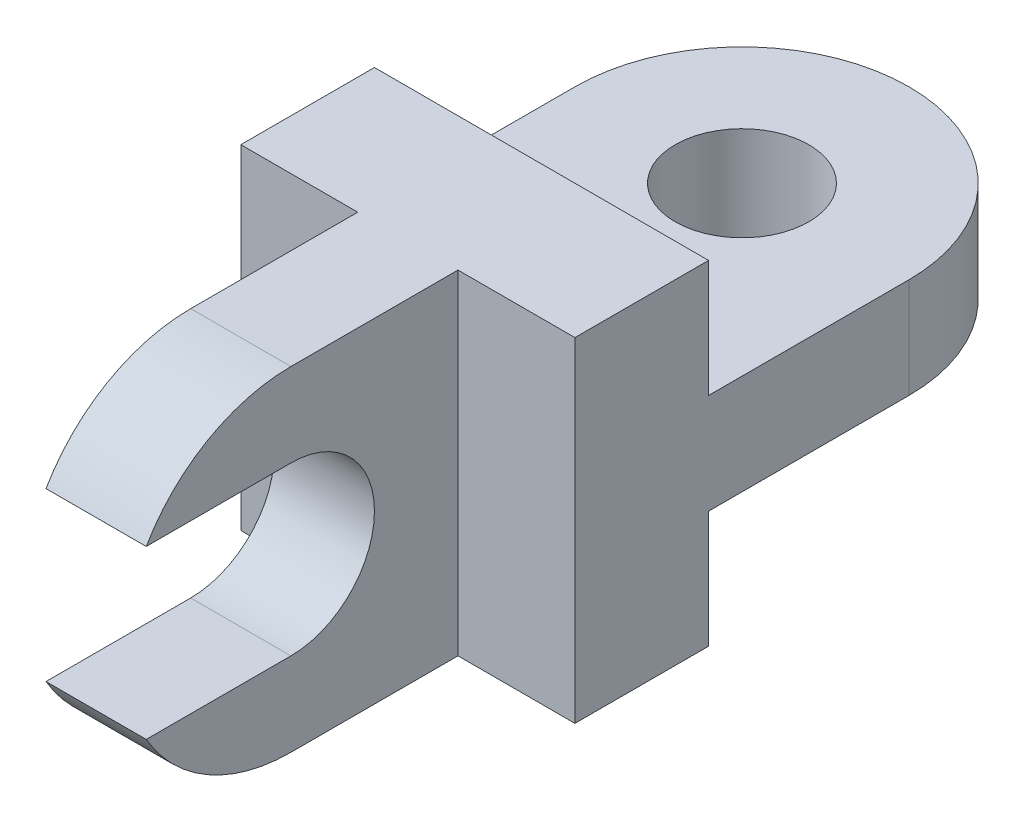
ISO-10303-21;
HEADER;
FILE_DESCRIPTION(('STEP AP214'),'2;1');
FILE_NAME('part.step','',(''),(''),'','','');
FILE_SCHEMA(('AUTOMOTIVE_DESIGN { 1 0 10303 214 1 1 1 1 }'));
ENDSEC;
DATA;
#1=APPLICATION_CONTEXT('core data for automotive mechanical design processes');
#2=APPLICATION_PROTOCOL_DEFINITION('international standard','automotive_design',2000,#1);
#3=PRODUCT_CONTEXT('',#1,'mechanical');
#4=PRODUCT('Part','Part','',(#3));
#5=PRODUCT_RELATED_PRODUCT_CATEGORY('part','',(#4));
#6=PRODUCT_DEFINITION_FORMATION('','',#4);
#7=PRODUCT_DEFINITION_CONTEXT('part definition',#1,'design');
#8=PRODUCT_DEFINITION('design','',#6,#7);
#9=PRODUCT_DEFINITION_SHAPE('','',#8);
#10=(LENGTH_UNIT() NAMED_UNIT(*) SI_UNIT(.MILLI.,.METRE.));
#11=(NAMED_UNIT(*) PLANE_ANGLE_UNIT() SI_UNIT($,.RADIAN.));
#12=(NAMED_UNIT(*) SI_UNIT($,.STERADIAN.) SOLID_ANGLE_UNIT());
#13=UNCERTAINTY_MEASURE_WITH_UNIT(LENGTH_MEASURE(1.E-05),#10,'distance_accuracy_value','');
#14=(GEOMETRIC_REPRESENTATION_CONTEXT(3) GLOBAL_UNCERTAINTY_ASSIGNED_CONTEXT((#13)) GLOBAL_UNIT_ASSIGNED_CONTEXT((#10,
#11,#12)) REPRESENTATION_CONTEXT('',''));
#15=CARTESIAN_POINT('',(0.,0.,0.));
#16=DIRECTION('',(0.,0.,1.));
#17=DIRECTION('',(1.,0.,0.));
#18=AXIS2_PLACEMENT_3D('',#15,#16,#17);
#19=CARTESIAN_POINT('',(0.,50.,193.3));
#20=DIRECTION('',(0.,0.,-1.));
#21=DIRECTION('',(-1.,0.,0.));
#22=AXIS2_PLACEMENT_3D('',#19,#20,#21);
#23=PLANE('',#22);
#24=DIRECTION('',(1.,0.,0.));
#25=VECTOR('',#24,1.);
#26=CARTESIAN_POINT('',(-50.,25.0021999032085,193.3));
#27=LINE('',#26,#25);
#28=CARTESIAN_POINT('',(-15.,25.0021999032085,193.3));
#29=VERTEX_POINT('',#28);
#30=CARTESIAN_POINT('',(15.,25.0021999032085,193.3));
#31=VERTEX_POINT('',#30);
#32=EDGE_CURVE('E158',#29,#31,#27,.T.);
#33=ORIENTED_EDGE('',*,*,#32,.F.);
#34=DIRECTION('',(0.,-1.,0.));
#35=VECTOR('',#34,1.);
#36=CARTESIAN_POINT('',(-15.,50.,193.3));
#37=LINE('',#36,#35);
#38=CARTESIAN_POINT('',(-15.,25.,193.3));
#39=VERTEX_POINT('',#38);
#40=EDGE_CURVE('E228',#29,#39,#37,.T.);
#41=ORIENTED_EDGE('',*,*,#40,.T.);
#42=DIRECTION('',(1.,0.,0.));
#43=VECTOR('',#42,1.);
#44=CARTESIAN_POINT('',(-50.,25.,193.3));
#45=LINE('',#44,#43);
#46=CARTESIAN_POINT('',(15.,25.,193.3));
#47=VERTEX_POINT('',#46);
#48=EDGE_CURVE('E179',#39,#47,#45,.T.);
#49=ORIENTED_EDGE('',*,*,#48,.T.);
#50=DIRECTION('',(0.,-1.,0.));
#51=VECTOR('',#50,1.);
#52=CARTESIAN_POINT('',(15.,50.,193.3));
#53=LINE('',#52,#51);
#54=EDGE_CURVE('E173',#31,#47,#53,.T.);
#55=ORIENTED_EDGE('',*,*,#54,.F.);
#56=EDGE_LOOP('',(#33,#41,#49,#55));
#57=FACE_BOUND('',#56,.T.);
#58=ADVANCED_FACE('F36',(#57),#23,.F.);
#59=DIRECTION('',(1.,0.,0.));
#60=VECTOR('',#59,1.);
#61=CARTESIAN_POINT('',(-50.,-25.,193.3));
#62=LINE('',#61,#60);
#63=CARTESIAN_POINT('',(-15.,-25.,193.3));
#64=VERTEX_POINT('',#63);
#65=CARTESIAN_POINT('',(15.,-25.,193.3));
#66=VERTEX_POINT('',#65);
#67=EDGE_CURVE('E176',#64,#66,#62,.T.);
#68=ORIENTED_EDGE('',*,*,#67,.F.);
#69=CARTESIAN_POINT('',(-15.,-25.0021999032085,193.3));
#70=VERTEX_POINT('',#69);
#71=EDGE_CURVE('E232',#64,#70,#37,.T.);
#72=ORIENTED_EDGE('',*,*,#71,.T.);
#73=DIRECTION('',(1.,0.,0.));
#74=VECTOR('',#73,1.);
#75=CARTESIAN_POINT('',(-50.,-25.0021999032085,193.3));
#76=LINE('',#75,#74);
#77=CARTESIAN_POINT('',(15.,-25.0021999032085,193.3));
#78=VERTEX_POINT('',#77);
#79=EDGE_CURVE('E309',#70,#78,#76,.T.);
#80=ORIENTED_EDGE('',*,*,#79,.T.);
#81=EDGE_CURVE('E181',#66,#78,#53,.T.);
#82=ORIENTED_EDGE('',*,*,#81,.F.);
#83=EDGE_LOOP('',(#68,#72,#80,#82));
#84=FACE_BOUND('',#83,.T.);
#85=ADVANCED_FACE('F331',(#84),#23,.F.);
#86=CARTESIAN_POINT('',(15.,50.,0.));
#87=DIRECTION('',(1.,0.,0.));
#88=DIRECTION('',(0.,0.,-1.));
#89=AXIS2_PLACEMENT_3D('',#86,#87,#88);
#90=PLANE('',#89);
#91=DIRECTION('',(0.,0.,1.));
#92=VECTOR('',#91,1.);
#93=CARTESIAN_POINT('',(15.,50.,0.));
#94=LINE('',#93,#92);
#95=CARTESIAN_POINT('',(15.,50.,100.));
#96=VERTEX_POINT('',#95);
#97=CARTESIAN_POINT('',(15.,50.,150.));
#98=VERTEX_POINT('',#97);
#99=EDGE_CURVE('E175',#96,#98,#94,.T.);
#100=ORIENTED_EDGE('',*,*,#99,.T.);
#101=CARTESIAN_POINT('',(15.,0.,150.));
#102=DIRECTION('',(1.,0.,0.));
#103=DIRECTION('',(0.,0.,-1.));
#104=AXIS2_PLACEMENT_3D('',#101,#102,#103);
#105=CIRCLE('',#104,50.);
#106=EDGE_CURVE('E59',#98,#31,#105,.T.);
#107=ORIENTED_EDGE('',*,*,#106,.T.);
#108=ORIENTED_EDGE('',*,*,#54,.T.);
#109=DIRECTION('',(0.,0.,1.));
#110=VECTOR('',#109,1.);
#111=CARTESIAN_POINT('',(15.,25.,0.));
#112=LINE('',#111,#110);
#113=CARTESIAN_POINT('',(15.,25.,150.));
#114=VERTEX_POINT('',#113);
#115=EDGE_CURVE('E316',#114,#47,#112,.T.);
#116=ORIENTED_EDGE('',*,*,#115,.F.);
#117=CARTESIAN_POINT('',(15.,0.,150.));
#118=DIRECTION('',(1.,0.,0.));
#119=DIRECTION('',(0.,0.,-1.));
#120=AXIS2_PLACEMENT_3D('',#117,#118,#119);
#121=CIRCLE('',#120,25.);
#122=CARTESIAN_POINT('',(15.,-25.,150.));
#123=VERTEX_POINT('',#122);
#124=EDGE_CURVE('E321',#123,#114,#121,.T.);
#125=ORIENTED_EDGE('',*,*,#124,.F.);
#126=DIRECTION('',(0.,0.,1.));
#127=VECTOR('',#126,1.);
#128=CARTESIAN_POINT('',(15.,-25.,0.));
#129=LINE('',#128,#127);
#130=EDGE_CURVE('E312',#123,#66,#129,.T.);
#131=ORIENTED_EDGE('',*,*,#130,.T.);
#132=ORIENTED_EDGE('',*,*,#81,.T.);
#133=CARTESIAN_POINT('',(15.,0.,150.));
#134=DIRECTION('',(1.,0.,0.));
#135=DIRECTION('',(0.,0.,-1.));
#136=AXIS2_PLACEMENT_3D('',#133,#134,#135);
#137=CIRCLE('',#136,50.);
#138=CARTESIAN_POINT('',(15.,-50.,150.));
#139=VERTEX_POINT('',#138);
#140=EDGE_CURVE('E268',#78,#139,#137,.T.);
#141=ORIENTED_EDGE('',*,*,#140,.T.);
#142=DIRECTION('',(0.,0.,1.));
#143=VECTOR('',#142,1.);
#144=CARTESIAN_POINT('',(15.,-50.,0.));
#145=LINE('',#144,#143);
#146=CARTESIAN_POINT('',(15.,-50.,100.));
#147=VERTEX_POINT('',#146);
#148=EDGE_CURVE('E267',#147,#139,#145,.T.);
#149=ORIENTED_EDGE('',*,*,#148,.F.);
#150=DIRECTION('',(0.,-1.,0.));
#151=VECTOR('',#150,1.);
#152=CARTESIAN_POINT('',(15.,50.,100.));
#153=LINE('',#152,#151);
#154=EDGE_CURVE('E187',#96,#147,#153,.T.);
#155=ORIENTED_EDGE('',*,*,#154,.F.);
#156=EDGE_LOOP('',(#100,#107,#108,#116,#125,#131,#132,#141,#149,#155));
#157=FACE_BOUND('',#156,.T.);
#158=ADVANCED_FACE('F171',(#157),#90,.T.);
#159=CARTESIAN_POINT('',(-15.,50.,0.));
#160=DIRECTION('',(1.,0.,0.));
#161=DIRECTION('',(0.,0.,-1.));
#162=AXIS2_PLACEMENT_3D('',#159,#160,#161);
#163=PLANE('',#162);
#164=CARTESIAN_POINT('',(-15.,0.,150.));
#165=DIRECTION('',(1.,0.,0.));
#166=DIRECTION('',(0.,0.,-1.));
#167=AXIS2_PLACEMENT_3D('',#164,#165,#166);
#168=CIRCLE('',#167,50.);
#169=CARTESIAN_POINT('',(-15.,50.,150.));
#170=VERTEX_POINT('',#169);
#171=EDGE_CURVE('E161',#170,#29,#168,.T.);
#172=ORIENTED_EDGE('',*,*,#171,.F.);
#173=DIRECTION('',(0.,0.,1.));
#174=VECTOR('',#173,1.);
#175=CARTESIAN_POINT('',(-15.,50.,0.));
#176=LINE('',#175,#174);
#177=CARTESIAN_POINT('',(-15.,50.,100.));
#178=VERTEX_POINT('',#177);
#179=EDGE_CURVE('E238',#178,#170,#176,.T.);
#180=ORIENTED_EDGE('',*,*,#179,.F.);
#181=DIRECTION('',(0.,-1.,0.));
#182=VECTOR('',#181,1.);
#183=CARTESIAN_POINT('',(-15.,50.,100.));
#184=LINE('',#183,#182);
#185=CARTESIAN_POINT('',(-15.,-50.,100.));
#186=VERTEX_POINT('',#185);
#187=EDGE_CURVE('E231',#178,#186,#184,.T.);
#188=ORIENTED_EDGE('',*,*,#187,.T.);
#189=DIRECTION('',(0.,0.,1.));
#190=VECTOR('',#189,1.);
#191=CARTESIAN_POINT('',(-15.,-50.,0.));
#192=LINE('',#191,#190);
#193=CARTESIAN_POINT('',(-15.,-50.,150.));
#194=VERTEX_POINT('',#193);
#195=EDGE_CURVE('E240',#186,#194,#192,.T.);
#196=ORIENTED_EDGE('',*,*,#195,.T.);
#197=CARTESIAN_POINT('',(-15.,0.,150.));
#198=DIRECTION('',(1.,0.,0.));
#199=DIRECTION('',(0.,0.,-1.));
#200=AXIS2_PLACEMENT_3D('',#197,#198,#199);
#201=CIRCLE('',#200,50.);
#202=EDGE_CURVE('E166',#70,#194,#201,.T.);
#203=ORIENTED_EDGE('',*,*,#202,.F.);
#204=ORIENTED_EDGE('',*,*,#71,.F.);
#205=DIRECTION('',(0.,0.,1.));
#206=VECTOR('',#205,1.);
#207=CARTESIAN_POINT('',(-15.,-25.,0.));
#208=LINE('',#207,#206);
#209=CARTESIAN_POINT('',(-15.,-25.,150.));
#210=VERTEX_POINT('',#209);
#211=EDGE_CURVE('E12',#210,#64,#208,.T.);
#212=ORIENTED_EDGE('',*,*,#211,.F.);
#213=CARTESIAN_POINT('',(-15.,0.,150.));
#214=DIRECTION('',(1.,0.,0.));
#215=DIRECTION('',(0.,0.,-1.));
#216=AXIS2_PLACEMENT_3D('',#213,#214,#215);
#217=CIRCLE('',#216,25.);
#218=CARTESIAN_POINT('',(-15.,25.,150.));
#219=VERTEX_POINT('',#218);
#220=EDGE_CURVE('E223',#210,#219,#217,.T.);
#221=ORIENTED_EDGE('',*,*,#220,.T.);
#222=DIRECTION('',(0.,0.,1.));
#223=VECTOR('',#222,1.);
#224=CARTESIAN_POINT('',(-15.,25.,0.));
#225=LINE('',#224,#223);
#226=EDGE_CURVE('E44',#219,#39,#225,.T.);
#227=ORIENTED_EDGE('',*,*,#226,.T.);
#228=ORIENTED_EDGE('',*,*,#40,.F.);
#229=EDGE_LOOP('',(#172,#180,#188,#196,#203,#204,#212,#221,#227,#228));
#230=FACE_BOUND('',#229,.T.);
#231=ADVANCED_FACE('F227',(#230),#163,.F.);
#232=CARTESIAN_POINT('',(0.,50.,0.));
#233=DIRECTION('',(0.,1.,0.));
#234=DIRECTION('',(0.,0.,1.));
#235=AXIS2_PLACEMENT_3D('',#232,#233,#234);
#236=PLANE('',#235);
#237=ORIENTED_EDGE('',*,*,#179,.T.);
#238=DIRECTION('',(1.,0.,0.));
#239=VECTOR('',#238,1.);
#240=CARTESIAN_POINT('',(-50.,50.,150.));
#241=LINE('',#240,#239);
#242=EDGE_CURVE('E221',#170,#98,#241,.T.);
#243=ORIENTED_EDGE('',*,*,#242,.T.);
#244=ORIENTED_EDGE('',*,*,#99,.F.);
#245=DIRECTION('',(-1.,0.,0.));
#246=VECTOR('',#245,1.);
#247=CARTESIAN_POINT('',(0.,50.,100.));
#248=LINE('',#247,#246);
#249=CARTESIAN_POINT('',(50.,50.,100.));
#250=VERTEX_POINT('',#249);
#251=EDGE_CURVE('E264',#250,#96,#248,.T.);
#252=ORIENTED_EDGE('',*,*,#251,.F.);
#253=DIRECTION('',(0.,0.,1.));
#254=VECTOR('',#253,1.);
#255=CARTESIAN_POINT('',(50.,50.,0.));
#256=LINE('',#255,#254);
#257=CARTESIAN_POINT('',(50.,50.,60.));
#258=VERTEX_POINT('',#257);
#259=EDGE_CURVE('E290',#258,#250,#256,.T.);
#260=ORIENTED_EDGE('',*,*,#259,.F.);
#261=DIRECTION('',(1.,0.,0.));
#262=VECTOR('',#261,1.);
#263=CARTESIAN_POINT('',(0.,50.,60.));
#264=LINE('',#263,#262);
#265=CARTESIAN_POINT('',(-50.,50.,60.));
#266=VERTEX_POINT('',#265);
#267=EDGE_CURVE('E296',#266,#258,#264,.T.);
#268=ORIENTED_EDGE('',*,*,#267,.F.);
#269=DIRECTION('',(0.,0.,1.));
#270=VECTOR('',#269,1.);
#271=CARTESIAN_POINT('',(-50.,50.,0.));
#272=LINE('',#271,#270);
#273=CARTESIAN_POINT('',(-50.,50.,100.));
#274=VERTEX_POINT('',#273);
#275=EDGE_CURVE('E299',#266,#274,#272,.T.);
#276=ORIENTED_EDGE('',*,*,#275,.T.);
#277=DIRECTION('',(1.,0.,0.));
#278=VECTOR('',#277,1.);
#279=CARTESIAN_POINT('',(0.,50.,100.));
#280=LINE('',#279,#278);
#281=EDGE_CURVE('E301',#274,#178,#280,.T.);
#282=ORIENTED_EDGE('',*,*,#281,.T.);
#283=EDGE_LOOP('',(#237,#243,#244,#252,#260,#268,#276,#282));
#284=FACE_BOUND('',#283,.T.);
#285=ADVANCED_FACE('F305',(#284),#236,.T.);
#286=CARTESIAN_POINT('',(0.,-50.,0.));
#287=DIRECTION('',(0.,1.,0.));
#288=DIRECTION('',(0.,0.,1.));
#289=AXIS2_PLACEMENT_3D('',#286,#287,#288);
#290=PLANE('',#289);
#291=DIRECTION('',(1.,0.,0.));
#292=VECTOR('',#291,1.);
#293=CARTESIAN_POINT('',(-50.,-50.,150.));
#294=LINE('',#293,#292);
#295=EDGE_CURVE('E219',#194,#139,#294,.T.);
#296=ORIENTED_EDGE('',*,*,#295,.F.);
#297=ORIENTED_EDGE('',*,*,#195,.F.);
#298=DIRECTION('',(1.,0.,0.));
#299=VECTOR('',#298,1.);
#300=CARTESIAN_POINT('',(0.,-50.,100.));
#301=LINE('',#300,#299);
#302=CARTESIAN_POINT('',(-50.,-50.,100.));
#303=VERTEX_POINT('',#302);
#304=EDGE_CURVE('E282',#303,#186,#301,.T.);
#305=ORIENTED_EDGE('',*,*,#304,.F.);
#306=DIRECTION('',(0.,0.,1.));
#307=VECTOR('',#306,1.);
#308=CARTESIAN_POINT('',(-50.,-50.,0.));
#309=LINE('',#308,#307);
#310=CARTESIAN_POINT('',(-50.,-50.,60.));
#311=VERTEX_POINT('',#310);
#312=EDGE_CURVE('E281',#311,#303,#309,.T.);
#313=ORIENTED_EDGE('',*,*,#312,.F.);
#314=DIRECTION('',(1.,0.,0.));
#315=VECTOR('',#314,1.);
#316=CARTESIAN_POINT('',(0.,-50.,60.));
#317=LINE('',#316,#315);
#318=CARTESIAN_POINT('',(50.,-50.,60.));
#319=VERTEX_POINT('',#318);
#320=EDGE_CURVE('E276',#311,#319,#317,.T.);
#321=ORIENTED_EDGE('',*,*,#320,.T.);
#322=DIRECTION('',(0.,0.,1.));
#323=VECTOR('',#322,1.);
#324=CARTESIAN_POINT('',(50.,-50.,0.));
#325=LINE('',#324,#323);
#326=CARTESIAN_POINT('',(50.,-50.,100.));
#327=VERTEX_POINT('',#326);
#328=EDGE_CURVE('E274',#319,#327,#325,.T.);
#329=ORIENTED_EDGE('',*,*,#328,.T.);
#330=DIRECTION('',(-1.,0.,0.));
#331=VECTOR('',#330,1.);
#332=CARTESIAN_POINT('',(0.,-50.,100.));
#333=LINE('',#332,#331);
#334=EDGE_CURVE('E261',#327,#147,#333,.T.);
#335=ORIENTED_EDGE('',*,*,#334,.T.);
#336=ORIENTED_EDGE('',*,*,#148,.T.);
#337=EDGE_LOOP('',(#296,#297,#305,#313,#321,#329,#335,#336));
#338=FACE_BOUND('',#337,.T.);
#339=ADVANCED_FACE('F272',(#338),#290,.F.);
#340=CARTESIAN_POINT('',(-50.,15.,0.));
#341=DIRECTION('',(1.,0.,0.));
#342=DIRECTION('',(0.,0.,-1.));
#343=AXIS2_PLACEMENT_3D('',#340,#341,#342);
#344=PLANE('',#343);
#345=DIRECTION('',(0.,0.,1.));
#346=VECTOR('',#345,1.);
#347=CARTESIAN_POINT('',(-50.,-15.,0.));
#348=LINE('',#347,#346);
#349=CARTESIAN_POINT('',(-50.,-15.,0.));
#350=VERTEX_POINT('',#349);
#351=CARTESIAN_POINT('',(-50.,-15.,60.));
#352=VERTEX_POINT('',#351);
#353=EDGE_CURVE('E180',#350,#352,#348,.T.);
#354=ORIENTED_EDGE('',*,*,#353,.T.);
#355=DIRECTION('',(0.,-1.,0.));
#356=VECTOR('',#355,1.);
#357=CARTESIAN_POINT('',(-50.,50.,60.));
#358=LINE('',#357,#356);
#359=EDGE_CURVE('E245',#352,#311,#358,.T.);
#360=ORIENTED_EDGE('',*,*,#359,.T.);
#361=ORIENTED_EDGE('',*,*,#312,.T.);
#362=DIRECTION('',(0.,-1.,0.));
#363=VECTOR('',#362,1.);
#364=CARTESIAN_POINT('',(-50.,50.,100.));
#365=LINE('',#364,#363);
#366=EDGE_CURVE('E235',#274,#303,#365,.T.);
#367=ORIENTED_EDGE('',*,*,#366,.F.);
#368=ORIENTED_EDGE('',*,*,#275,.F.);
#369=CARTESIAN_POINT('',(-50.,15.,60.));
#370=VERTEX_POINT('',#369);
#371=EDGE_CURVE('E246',#266,#370,#358,.T.);
#372=ORIENTED_EDGE('',*,*,#371,.T.);
#373=DIRECTION('',(0.,0.,1.));
#374=VECTOR('',#373,1.);
#375=CARTESIAN_POINT('',(-50.,15.,0.));
#376=LINE('',#375,#374);
#377=CARTESIAN_POINT('',(-50.,15.,0.));
#378=VERTEX_POINT('',#377);
#379=EDGE_CURVE('E191',#378,#370,#376,.T.);
#380=ORIENTED_EDGE('',*,*,#379,.F.);
#381=DIRECTION('',(0.,-1.,0.));
#382=VECTOR('',#381,1.);
#383=CARTESIAN_POINT('',(-50.,15.,0.));
#384=LINE('',#383,#382);
#385=EDGE_CURVE('E205',#378,#350,#384,.T.);
#386=ORIENTED_EDGE('',*,*,#385,.T.);
#387=EDGE_LOOP('',(#354,#360,#361,#367,#368,#372,#380,#386));
#388=FACE_BOUND('',#387,.T.);
#389=ADVANCED_FACE('F38',(#388),#344,.F.);
#390=CARTESIAN_POINT('',(50.,15.,0.));
#391=DIRECTION('',(1.,0.,0.));
#392=DIRECTION('',(0.,0.,-1.));
#393=AXIS2_PLACEMENT_3D('',#390,#391,#392);
#394=PLANE('',#393);
#395=DIRECTION('',(0.,0.,1.));
#396=VECTOR('',#395,1.);
#397=CARTESIAN_POINT('',(50.,-15.,0.));
#398=LINE('',#397,#396);
#399=CARTESIAN_POINT('',(50.,-15.,0.));
#400=VERTEX_POINT('',#399);
#401=CARTESIAN_POINT('',(50.,-15.,60.));
#402=VERTEX_POINT('',#401);
#403=EDGE_CURVE('E208',#400,#402,#398,.T.);
#404=ORIENTED_EDGE('',*,*,#403,.F.);
#405=DIRECTION('',(0.,-1.,0.));
#406=VECTOR('',#405,1.);
#407=CARTESIAN_POINT('',(50.,15.,0.));
#408=LINE('',#407,#406);
#409=CARTESIAN_POINT('',(50.,15.,0.));
#410=VERTEX_POINT('',#409);
#411=EDGE_CURVE('E217',#410,#400,#408,.T.);
#412=ORIENTED_EDGE('',*,*,#411,.F.);
#413=DIRECTION('',(0.,0.,1.));
#414=VECTOR('',#413,1.);
#415=CARTESIAN_POINT('',(50.,15.,0.));
#416=LINE('',#415,#414);
#417=CARTESIAN_POINT('',(50.,15.,60.));
#418=VERTEX_POINT('',#417);
#419=EDGE_CURVE('E198',#410,#418,#416,.T.);
#420=ORIENTED_EDGE('',*,*,#419,.T.);
#421=DIRECTION('',(0.,-1.,0.));
#422=VECTOR('',#421,1.);
#423=CARTESIAN_POINT('',(50.,50.,60.));
#424=LINE('',#423,#422);
#425=EDGE_CURVE('E250',#258,#418,#424,.T.);
#426=ORIENTED_EDGE('',*,*,#425,.F.);
#427=ORIENTED_EDGE('',*,*,#259,.T.);
#428=DIRECTION('',(0.,-1.,0.));
#429=VECTOR('',#428,1.);
#430=CARTESIAN_POINT('',(50.,50.,100.));
#431=LINE('',#430,#429);
#432=EDGE_CURVE('E251',#250,#327,#431,.T.);
#433=ORIENTED_EDGE('',*,*,#432,.T.);
#434=ORIENTED_EDGE('',*,*,#328,.F.);
#435=EDGE_CURVE('E249',#402,#319,#424,.T.);
#436=ORIENTED_EDGE('',*,*,#435,.F.);
#437=EDGE_LOOP('',(#404,#412,#420,#426,#427,#433,#434,#436));
#438=FACE_BOUND('',#437,.T.);
#439=ADVANCED_FACE('F369',(#438),#394,.T.);
#440=CARTESIAN_POINT('',(0.,15.,0.));
#441=DIRECTION('',(0.,-1.,0.));
#442=DIRECTION('',(0.,0.,-1.));
#443=AXIS2_PLACEMENT_3D('',#440,#441,#442);
#444=CYLINDRICAL_SURFACE('',#443,50.);
#445=CARTESIAN_POINT('',(0.,-15.,0.));
#446=DIRECTION('',(0.,1.,0.));
#447=DIRECTION('',(0.,0.,1.));
#448=AXIS2_PLACEMENT_3D('',#445,#446,#447);
#449=CIRCLE('',#448,50.);
#450=EDGE_CURVE('E211',#400,#350,#449,.T.);
#451=ORIENTED_EDGE('',*,*,#450,.T.);
#452=ORIENTED_EDGE('',*,*,#385,.F.);
#453=CARTESIAN_POINT('',(0.,15.,0.));
#454=DIRECTION('',(0.,1.,0.));
#455=DIRECTION('',(0.,0.,1.));
#456=AXIS2_PLACEMENT_3D('',#453,#454,#455);
#457=CIRCLE('',#456,50.);
#458=EDGE_CURVE('E201',#410,#378,#457,.T.);
#459=ORIENTED_EDGE('',*,*,#458,.F.);
#460=ORIENTED_EDGE('',*,*,#411,.T.);
#461=EDGE_LOOP('',(#451,#452,#459,#460));
#462=FACE_BOUND('',#461,.T.);
#463=ADVANCED_FACE('F366',(#462),#444,.T.);
#464=CARTESIAN_POINT('',(0.,15.,0.));
#465=DIRECTION('',(0.,-1.,0.));
#466=DIRECTION('',(0.,0.,-1.));
#467=AXIS2_PLACEMENT_3D('',#464,#465,#466);
#468=CYLINDRICAL_SURFACE('',#467,20.);
#469=CARTESIAN_POINT('',(0.,15.,0.));
#470=DIRECTION('',(0.,1.,0.));
#471=DIRECTION('',(0.,0.,1.));
#472=AXIS2_PLACEMENT_3D('',#469,#470,#471);
#473=CIRCLE('',#472,20.);
#474=CARTESIAN_POINT('',(0.,15.,20.));
#475=VERTEX_POINT('',#474);
#476=EDGE_CURVE('E203',#475,#475,#473,.T.);
#477=ORIENTED_EDGE('',*,*,#476,.T.);
#478=EDGE_LOOP('',(#477));
#479=FACE_BOUND('',#478,.T.);
#480=CARTESIAN_POINT('',(0.,-15.,0.));
#481=DIRECTION('',(0.,1.,0.));
#482=DIRECTION('',(0.,0.,1.));
#483=AXIS2_PLACEMENT_3D('',#480,#481,#482);
#484=CIRCLE('',#483,20.);
#485=CARTESIAN_POINT('',(0.,-15.,20.));
#486=VERTEX_POINT('',#485);
#487=EDGE_CURVE('E195',#486,#486,#484,.T.);
#488=ORIENTED_EDGE('',*,*,#487,.F.);
#489=EDGE_LOOP('',(#488));
#490=FACE_BOUND('',#489,.T.);
#491=ADVANCED_FACE('F358',(#479,#490),#468,.F.);
#492=CARTESIAN_POINT('',(0.,15.,0.));
#493=DIRECTION('',(0.,1.,0.));
#494=DIRECTION('',(0.,0.,1.));
#495=AXIS2_PLACEMENT_3D('',#492,#493,#494);
#496=PLANE('',#495);
#497=ORIENTED_EDGE('',*,*,#379,.T.);
#498=DIRECTION('',(1.,0.,0.));
#499=VECTOR('',#498,1.);
#500=CARTESIAN_POINT('',(0.,15.,60.));
#501=LINE('',#500,#499);
#502=EDGE_CURVE('E194',#370,#418,#501,.T.);
#503=ORIENTED_EDGE('',*,*,#502,.T.);
#504=ORIENTED_EDGE('',*,*,#419,.F.);
#505=ORIENTED_EDGE('',*,*,#458,.T.);
#506=EDGE_LOOP('',(#497,#503,#504,#505));
#507=FACE_BOUND('',#506,.T.);
#508=ORIENTED_EDGE('',*,*,#476,.F.);
#509=EDGE_LOOP('',(#508));
#510=FACE_BOUND('',#509,.T.);
#511=ADVANCED_FACE('F354',(#507,#510),#496,.T.);
#512=CARTESIAN_POINT('',(0.,-15.,0.));
#513=DIRECTION('',(0.,1.,0.));
#514=DIRECTION('',(0.,0.,1.));
#515=AXIS2_PLACEMENT_3D('',#512,#513,#514);
#516=PLANE('',#515);
#517=ORIENTED_EDGE('',*,*,#353,.F.);
#518=ORIENTED_EDGE('',*,*,#450,.F.);
#519=ORIENTED_EDGE('',*,*,#403,.T.);
#520=DIRECTION('',(1.,0.,0.));
#521=VECTOR('',#520,1.);
#522=CARTESIAN_POINT('',(0.,-15.,60.));
#523=LINE('',#522,#521);
#524=EDGE_CURVE('E184',#352,#402,#523,.T.);
#525=ORIENTED_EDGE('',*,*,#524,.F.);
#526=EDGE_LOOP('',(#517,#518,#519,#525));
#527=FACE_BOUND('',#526,.T.);
#528=ORIENTED_EDGE('',*,*,#487,.T.);
#529=EDGE_LOOP('',(#528));
#530=FACE_BOUND('',#529,.T.);
#531=ADVANCED_FACE('F357',(#527,#530),#516,.F.);
#532=CARTESIAN_POINT('',(0.,50.,60.));
#533=DIRECTION('',(0.,0.,-1.));
#534=DIRECTION('',(-1.,0.,0.));
#535=AXIS2_PLACEMENT_3D('',#532,#533,#534);
#536=PLANE('',#535);
#537=ORIENTED_EDGE('',*,*,#502,.F.);
#538=ORIENTED_EDGE('',*,*,#371,.F.);
#539=ORIENTED_EDGE('',*,*,#267,.T.);
#540=ORIENTED_EDGE('',*,*,#425,.T.);
#541=EDGE_LOOP('',(#537,#538,#539,#540));
#542=FACE_BOUND('',#541,.T.);
#543=ADVANCED_FACE('F362',(#542),#536,.T.);
#544=CARTESIAN_POINT('',(0.,50.,100.));
#545=DIRECTION('',(0.,0.,1.));
#546=DIRECTION('',(1.,0.,0.));
#547=AXIS2_PLACEMENT_3D('',#544,#545,#546);
#548=PLANE('',#547);
#549=ORIENTED_EDGE('',*,*,#334,.F.);
#550=ORIENTED_EDGE('',*,*,#432,.F.);
#551=ORIENTED_EDGE('',*,*,#251,.T.);
#552=ORIENTED_EDGE('',*,*,#154,.T.);
#553=EDGE_LOOP('',(#549,#550,#551,#552));
#554=FACE_BOUND('',#553,.T.);
#555=ADVANCED_FACE('F259',(#554),#548,.T.);
#556=ORIENTED_EDGE('',*,*,#359,.F.);
#557=ORIENTED_EDGE('',*,*,#524,.T.);
#558=ORIENTED_EDGE('',*,*,#435,.T.);
#559=ORIENTED_EDGE('',*,*,#320,.F.);
#560=EDGE_LOOP('',(#556,#557,#558,#559));
#561=FACE_BOUND('',#560,.T.);
#562=ADVANCED_FACE('F395',(#561),#536,.T.);
#563=CARTESIAN_POINT('',(0.,50.,100.));
#564=DIRECTION('',(0.,0.,-1.));
#565=DIRECTION('',(-1.,0.,0.));
#566=AXIS2_PLACEMENT_3D('',#563,#564,#565);
#567=PLANE('',#566);
#568=ORIENTED_EDGE('',*,*,#304,.T.);
#569=ORIENTED_EDGE('',*,*,#187,.F.);
#570=ORIENTED_EDGE('',*,*,#281,.F.);
#571=ORIENTED_EDGE('',*,*,#366,.T.);
#572=EDGE_LOOP('',(#568,#569,#570,#571));
#573=FACE_BOUND('',#572,.T.);
#574=ADVANCED_FACE('F393',(#573),#567,.F.);
#575=CARTESIAN_POINT('',(-50.,0.,150.));
#576=DIRECTION('',(1.,0.,0.));
#577=DIRECTION('',(0.,0.,-1.));
#578=AXIS2_PLACEMENT_3D('',#575,#576,#577);
#579=CYLINDRICAL_SURFACE('',#578,50.);
#580=ORIENTED_EDGE('',*,*,#202,.T.);
#581=ORIENTED_EDGE('',*,*,#295,.T.);
#582=ORIENTED_EDGE('',*,*,#140,.F.);
#583=ORIENTED_EDGE('',*,*,#79,.F.);
#584=EDGE_LOOP('',(#580,#581,#582,#583));
#585=FACE_BOUND('',#584,.T.);
#586=ADVANCED_FACE('F333',(#585),#579,.T.);
#587=CARTESIAN_POINT('',(-50.,0.,150.));
#588=DIRECTION('',(1.,0.,0.));
#589=DIRECTION('',(0.,0.,-1.));
#590=AXIS2_PLACEMENT_3D('',#587,#588,#589);
#591=CYLINDRICAL_SURFACE('',#590,50.);
#592=ORIENTED_EDGE('',*,*,#171,.T.);
#593=ORIENTED_EDGE('',*,*,#32,.T.);
#594=ORIENTED_EDGE('',*,*,#106,.F.);
#595=ORIENTED_EDGE('',*,*,#242,.F.);
#596=EDGE_LOOP('',(#592,#593,#594,#595));
#597=FACE_BOUND('',#596,.T.);
#598=ADVANCED_FACE('F159',(#597),#591,.T.);
#599=CARTESIAN_POINT('',(-50.,-25.,0.));
#600=DIRECTION('',(0.,1.,0.));
#601=DIRECTION('',(0.,0.,1.));
#602=AXIS2_PLACEMENT_3D('',#599,#600,#601);
#603=PLANE('',#602);
#604=ORIENTED_EDGE('',*,*,#211,.T.);
#605=ORIENTED_EDGE('',*,*,#67,.T.);
#606=ORIENTED_EDGE('',*,*,#130,.F.);
#607=DIRECTION('',(1.,0.,0.));
#608=VECTOR('',#607,1.);
#609=CARTESIAN_POINT('',(-50.,-25.,150.));
#610=LINE('',#609,#608);
#611=EDGE_CURVE('E314',#210,#123,#610,.T.);
#612=ORIENTED_EDGE('',*,*,#611,.F.);
#613=EDGE_LOOP('',(#604,#605,#606,#612));
#614=FACE_BOUND('',#613,.T.);
#615=ADVANCED_FACE('F334',(#614),#603,.T.);
#616=CARTESIAN_POINT('',(-50.,25.,0.));
#617=DIRECTION('',(0.,1.,0.));
#618=DIRECTION('',(0.,0.,1.));
#619=AXIS2_PLACEMENT_3D('',#616,#617,#618);
#620=PLANE('',#619);
#621=DIRECTION('',(1.,0.,0.));
#622=VECTOR('',#621,1.);
#623=CARTESIAN_POINT('',(-50.,25.,150.));
#624=LINE('',#623,#622);
#625=EDGE_CURVE('E51',#219,#114,#624,.T.);
#626=ORIENTED_EDGE('',*,*,#625,.T.);
#627=ORIENTED_EDGE('',*,*,#115,.T.);
#628=ORIENTED_EDGE('',*,*,#48,.F.);
#629=ORIENTED_EDGE('',*,*,#226,.F.);
#630=EDGE_LOOP('',(#626,#627,#628,#629));
#631=FACE_BOUND('',#630,.T.);
#632=ADVANCED_FACE('F336',(#631),#620,.F.);
#633=CARTESIAN_POINT('',(-50.,0.,150.));
#634=DIRECTION('',(1.,0.,0.));
#635=DIRECTION('',(0.,0.,-1.));
#636=AXIS2_PLACEMENT_3D('',#633,#634,#635);
#637=CYLINDRICAL_SURFACE('',#636,25.);
#638=ORIENTED_EDGE('',*,*,#611,.T.);
#639=ORIENTED_EDGE('',*,*,#124,.T.);
#640=ORIENTED_EDGE('',*,*,#625,.F.);
#641=ORIENTED_EDGE('',*,*,#220,.F.);
#642=EDGE_LOOP('',(#638,#639,#640,#641));
#643=FACE_BOUND('',#642,.T.);
#644=ADVANCED_FACE('F335',(#643),#637,.F.);
#645=CLOSED_SHELL('',(#58,#85,#158,#231,#285,#339,#389,#439,#463,#491,#511,#531,#543,#555,#562,
#574,#586,#598,#615,#632,#644));
#646=MANIFOLD_SOLID_BREP('B2',#645);
#647=ADVANCED_BREP_SHAPE_REPRESENTATION('',(#18,#646),#14);
#648=SHAPE_DEFINITION_REPRESENTATION(#9,#647);
ENDSEC;
END-ISO-10303-21;
